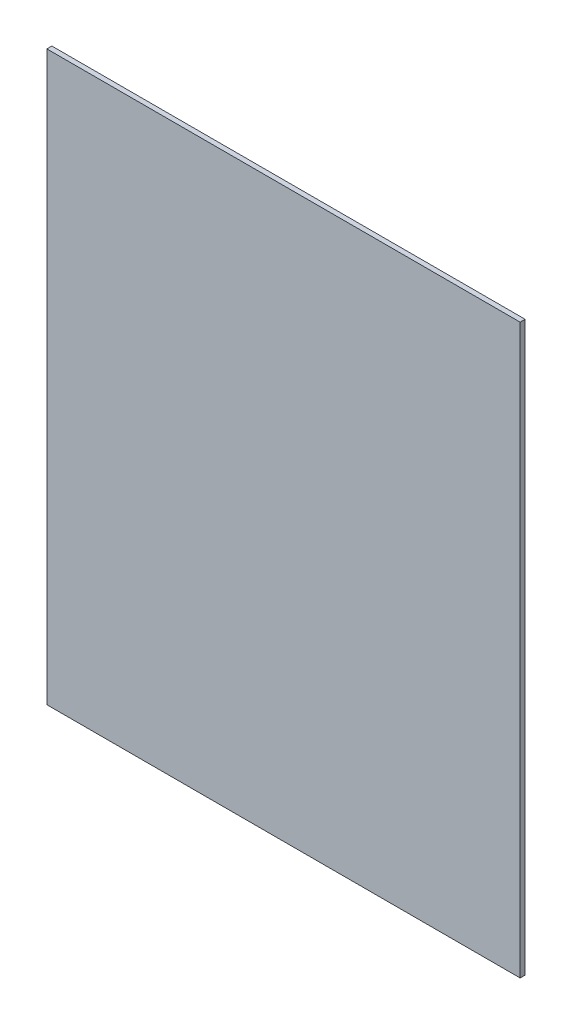
ISO-10303-21;
HEADER;
FILE_DESCRIPTION(('STEP AP214'),'2;1');
FILE_NAME('part.step','',(''),(''),'','','');
FILE_SCHEMA(('AUTOMOTIVE_DESIGN { 1 0 10303 214 1 1 1 1 }'));
ENDSEC;
DATA;
#1=APPLICATION_CONTEXT('core data for automotive mechanical design processes');
#2=APPLICATION_PROTOCOL_DEFINITION('international standard','automotive_design',2000,#1);
#3=PRODUCT_CONTEXT('',#1,'mechanical');
#4=PRODUCT('Part','Part','',(#3));
#5=PRODUCT_RELATED_PRODUCT_CATEGORY('part','',(#4));
#6=PRODUCT_DEFINITION_FORMATION('','',#4);
#7=PRODUCT_DEFINITION_CONTEXT('part definition',#1,'design');
#8=PRODUCT_DEFINITION('design','',#6,#7);
#9=PRODUCT_DEFINITION_SHAPE('','',#8);
#10=(LENGTH_UNIT() NAMED_UNIT(*) SI_UNIT(.MILLI.,.METRE.));
#11=(NAMED_UNIT(*) PLANE_ANGLE_UNIT() SI_UNIT($,.RADIAN.));
#12=(NAMED_UNIT(*) SI_UNIT($,.STERADIAN.) SOLID_ANGLE_UNIT());
#13=UNCERTAINTY_MEASURE_WITH_UNIT(LENGTH_MEASURE(1.E-05),#10,'distance_accuracy_value','');
#14=(GEOMETRIC_REPRESENTATION_CONTEXT(3) GLOBAL_UNCERTAINTY_ASSIGNED_CONTEXT((#13)) GLOBAL_UNIT_ASSIGNED_CONTEXT((#10,
#11,#12)) REPRESENTATION_CONTEXT('',''));
#15=CARTESIAN_POINT('',(0.,0.,0.));
#16=DIRECTION('',(0.,0.,1.));
#17=DIRECTION('',(1.,0.,0.));
#18=AXIS2_PLACEMENT_3D('',#15,#16,#17);
#19=CARTESIAN_POINT('',(-0.47499778,0.56999886,0.01));
#20=DIRECTION('',(0.,0.,-1.));
#21=DIRECTION('',(0.,-1.,0.));
#22=AXIS2_PLACEMENT_3D('',#19,#20,#21);
#23=PLANE('',#22);
#24=DIRECTION('',(1.,0.,0.));
#25=VECTOR('',#24,1.);
#26=CARTESIAN_POINT('',(-0.47499778,-0.56999886,0.01));
#27=LINE('',#26,#25);
#28=CARTESIAN_POINT('',(-0.47499778,-0.56999886,0.01));
#29=VERTEX_POINT('',#28);
#30=CARTESIAN_POINT('',(0.47500032,-0.56999886,0.01));
#31=VERTEX_POINT('',#30);
#32=EDGE_CURVE('E79',#29,#31,#27,.T.);
#33=ORIENTED_EDGE('',*,*,#32,.T.);
#34=DIRECTION('',(0.,1.,0.));
#35=VECTOR('',#34,1.);
#36=CARTESIAN_POINT('',(0.47500032,-0.56999886,0.01));
#37=LINE('',#36,#35);
#38=CARTESIAN_POINT('',(0.47500032,0.56999886,0.01));
#39=VERTEX_POINT('',#38);
#40=EDGE_CURVE('E19',#31,#39,#37,.T.);
#41=ORIENTED_EDGE('',*,*,#40,.T.);
#42=DIRECTION('',(-1.,0.,0.));
#43=VECTOR('',#42,1.);
#44=CARTESIAN_POINT('',(0.47500032,0.56999886,0.01));
#45=LINE('',#44,#43);
#46=CARTESIAN_POINT('',(-0.47499778,0.56999886,0.01));
#47=VERTEX_POINT('',#46);
#48=EDGE_CURVE('E11',#39,#47,#45,.T.);
#49=ORIENTED_EDGE('',*,*,#48,.T.);
#50=DIRECTION('',(0.,-1.,0.));
#51=VECTOR('',#50,1.);
#52=CARTESIAN_POINT('',(-0.47499778,0.56999886,0.01));
#53=LINE('',#52,#51);
#54=EDGE_CURVE('E86',#47,#29,#53,.T.);
#55=ORIENTED_EDGE('',*,*,#54,.T.);
#56=EDGE_LOOP('',(#33,#41,#49,#55));
#57=FACE_BOUND('',#56,.T.);
#58=ADVANCED_FACE('F16',(#57),#23,.F.);
#59=CARTESIAN_POINT('',(0.47500032,0.56999886,0.));
#60=DIRECTION('',(0.,-1.,0.));
#61=DIRECTION('',(0.,0.,-1.));
#62=AXIS2_PLACEMENT_3D('',#59,#60,#61);
#63=PLANE('',#62);
#64=DIRECTION('',(0.,0.,1.));
#65=VECTOR('',#64,1.);
#66=CARTESIAN_POINT('',(-0.47499778,0.56999886,0.));
#67=LINE('',#66,#65);
#68=CARTESIAN_POINT('',(-0.47499778,0.56999886,0.));
#69=VERTEX_POINT('',#68);
#70=EDGE_CURVE('E68',#69,#47,#67,.T.);
#71=ORIENTED_EDGE('',*,*,#70,.T.);
#72=ORIENTED_EDGE('',*,*,#48,.F.);
#73=DIRECTION('',(0.,0.,-1.));
#74=VECTOR('',#73,1.);
#75=CARTESIAN_POINT('',(0.47500032,0.56999886,0.));
#76=LINE('',#75,#74);
#77=CARTESIAN_POINT('',(0.47500032,0.56999886,0.));
#78=VERTEX_POINT('',#77);
#79=EDGE_CURVE('E74',#39,#78,#76,.T.);
#80=ORIENTED_EDGE('',*,*,#79,.T.);
#81=DIRECTION('',(1.,0.,0.));
#82=VECTOR('',#81,1.);
#83=CARTESIAN_POINT('',(-0.47499778,0.56999886,0.));
#84=LINE('',#83,#82);
#85=EDGE_CURVE('E101',#69,#78,#84,.T.);
#86=ORIENTED_EDGE('',*,*,#85,.F.);
#87=EDGE_LOOP('',(#71,#72,#80,#86));
#88=FACE_BOUND('',#87,.T.);
#89=ADVANCED_FACE('F117',(#88),#63,.F.);
#90=CARTESIAN_POINT('',(0.47500032,-0.56999886,0.));
#91=DIRECTION('',(-1.,0.,0.));
#92=DIRECTION('',(0.,0.,1.));
#93=AXIS2_PLACEMENT_3D('',#90,#91,#92);
#94=PLANE('',#93);
#95=ORIENTED_EDGE('',*,*,#79,.F.);
#96=ORIENTED_EDGE('',*,*,#40,.F.);
#97=DIRECTION('',(0.,0.,-1.));
#98=VECTOR('',#97,1.);
#99=CARTESIAN_POINT('',(0.47500032,-0.56999886,0.));
#100=LINE('',#99,#98);
#101=CARTESIAN_POINT('',(0.47500032,-0.56999886,0.));
#102=VERTEX_POINT('',#101);
#103=EDGE_CURVE('E82',#31,#102,#100,.T.);
#104=ORIENTED_EDGE('',*,*,#103,.T.);
#105=DIRECTION('',(0.,-1.,0.));
#106=VECTOR('',#105,1.);
#107=CARTESIAN_POINT('',(0.47500032,0.56999886,0.));
#108=LINE('',#107,#106);
#109=EDGE_CURVE('E94',#78,#102,#108,.T.);
#110=ORIENTED_EDGE('',*,*,#109,.F.);
#111=EDGE_LOOP('',(#95,#96,#104,#110));
#112=FACE_BOUND('',#111,.T.);
#113=ADVANCED_FACE('F169',(#112),#94,.F.);
#114=CARTESIAN_POINT('',(-0.47499778,-0.56999886,0.));
#115=DIRECTION('',(0.,1.,0.));
#116=DIRECTION('',(1.,0.,0.));
#117=AXIS2_PLACEMENT_3D('',#114,#115,#116);
#118=PLANE('',#117);
#119=ORIENTED_EDGE('',*,*,#103,.F.);
#120=ORIENTED_EDGE('',*,*,#32,.F.);
#121=DIRECTION('',(0.,0.,-1.));
#122=VECTOR('',#121,1.);
#123=CARTESIAN_POINT('',(-0.47499778,-0.56999886,0.));
#124=LINE('',#123,#122);
#125=CARTESIAN_POINT('',(-0.47499778,-0.56999886,0.));
#126=VERTEX_POINT('',#125);
#127=EDGE_CURVE('E60',#29,#126,#124,.T.);
#128=ORIENTED_EDGE('',*,*,#127,.T.);
#129=DIRECTION('',(-1.,0.,0.));
#130=VECTOR('',#129,1.);
#131=CARTESIAN_POINT('',(-0.47499778,-0.56999886,0.));
#132=LINE('',#131,#130);
#133=EDGE_CURVE('E105',#102,#126,#132,.T.);
#134=ORIENTED_EDGE('',*,*,#133,.F.);
#135=EDGE_LOOP('',(#119,#120,#128,#134));
#136=FACE_BOUND('',#135,.T.);
#137=ADVANCED_FACE('F81',(#136),#118,.F.);
#138=CARTESIAN_POINT('',(-0.47499778,0.56999886,0.));
#139=DIRECTION('',(1.,0.,0.));
#140=DIRECTION('',(0.,1.,0.));
#141=AXIS2_PLACEMENT_3D('',#138,#139,#140);
#142=PLANE('',#141);
#143=ORIENTED_EDGE('',*,*,#127,.F.);
#144=ORIENTED_EDGE('',*,*,#54,.F.);
#145=ORIENTED_EDGE('',*,*,#70,.F.);
#146=DIRECTION('',(0.,1.,0.));
#147=VECTOR('',#146,1.);
#148=CARTESIAN_POINT('',(-0.47499778,0.56999886,0.));
#149=LINE('',#148,#147);
#150=EDGE_CURVE('E91',#126,#69,#149,.T.);
#151=ORIENTED_EDGE('',*,*,#150,.F.);
#152=EDGE_LOOP('',(#143,#144,#145,#151));
#153=FACE_BOUND('',#152,.T.);
#154=ADVANCED_FACE('F89',(#153),#142,.F.);
#155=CARTESIAN_POINT('',(-0.47499778,0.56999886,0.));
#156=DIRECTION('',(0.,0.,-1.));
#157=DIRECTION('',(0.,-1.,0.));
#158=AXIS2_PLACEMENT_3D('',#155,#156,#157);
#159=PLANE('',#158);
#160=ORIENTED_EDGE('',*,*,#133,.T.);
#161=ORIENTED_EDGE('',*,*,#150,.T.);
#162=ORIENTED_EDGE('',*,*,#85,.T.);
#163=ORIENTED_EDGE('',*,*,#109,.T.);
#164=EDGE_LOOP('',(#160,#161,#162,#163));
#165=FACE_BOUND('',#164,.T.);
#166=ADVANCED_FACE('F119',(#165),#159,.T.);
#167=CLOSED_SHELL('',(#58,#89,#113,#137,#154,#166));
#168=MANIFOLD_SOLID_BREP('B1',#167);
#169=ADVANCED_BREP_SHAPE_REPRESENTATION('',(#18,#168),#14);
#170=SHAPE_DEFINITION_REPRESENTATION(#9,#169);
ENDSEC;
END-ISO-10303-21;
